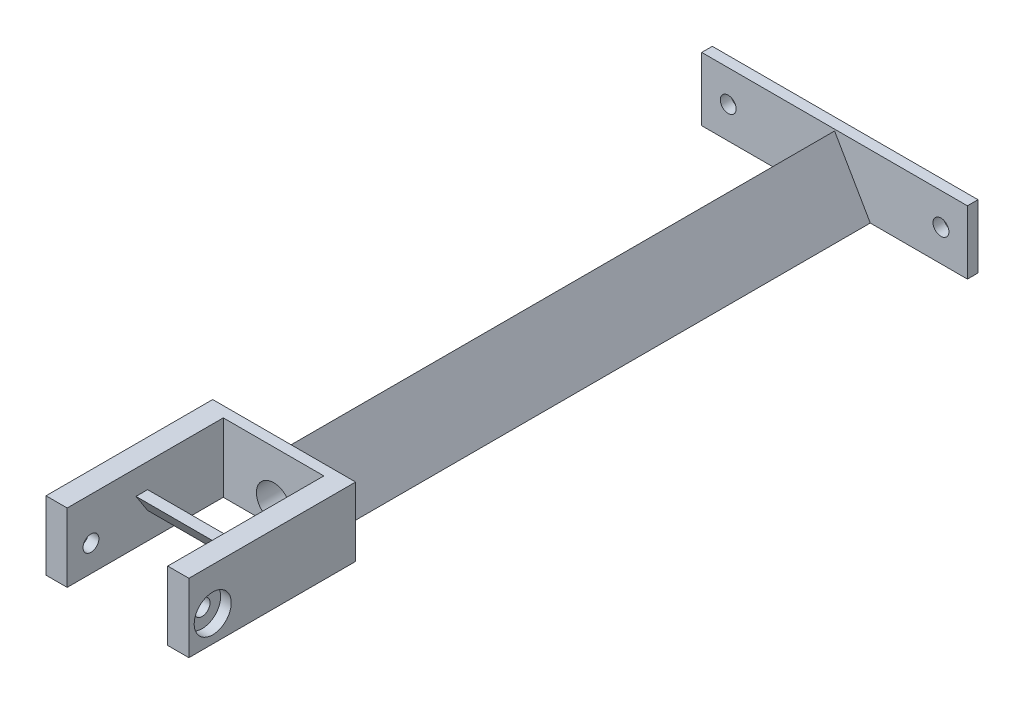
ISO-10303-21;
HEADER;
FILE_DESCRIPTION(('STEP AP214'),'2;1');
FILE_NAME('part.step','',(''),(''),'','','');
FILE_SCHEMA(('AUTOMOTIVE_DESIGN { 1 0 10303 214 1 1 1 1 }'));
ENDSEC;
DATA;
#1=APPLICATION_CONTEXT('core data for automotive mechanical design processes');
#2=APPLICATION_PROTOCOL_DEFINITION('international standard','automotive_design',2000,#1);
#3=PRODUCT_CONTEXT('',#1,'mechanical');
#4=PRODUCT('Part','Part','',(#3));
#5=PRODUCT_RELATED_PRODUCT_CATEGORY('part','',(#4));
#6=PRODUCT_DEFINITION_FORMATION('','',#4);
#7=PRODUCT_DEFINITION_CONTEXT('part definition',#1,'design');
#8=PRODUCT_DEFINITION('design','',#6,#7);
#9=PRODUCT_DEFINITION_SHAPE('','',#8);
#10=(LENGTH_UNIT() NAMED_UNIT(*) SI_UNIT(.MILLI.,.METRE.));
#11=(NAMED_UNIT(*) PLANE_ANGLE_UNIT() SI_UNIT($,.RADIAN.));
#12=(NAMED_UNIT(*) SI_UNIT($,.STERADIAN.) SOLID_ANGLE_UNIT());
#13=UNCERTAINTY_MEASURE_WITH_UNIT(LENGTH_MEASURE(1.E-05),#10,'distance_accuracy_value','');
#14=(GEOMETRIC_REPRESENTATION_CONTEXT(3) GLOBAL_UNCERTAINTY_ASSIGNED_CONTEXT((#13)) GLOBAL_UNIT_ASSIGNED_CONTEXT((#10,
#11,#12)) REPRESENTATION_CONTEXT('',''));
#15=CARTESIAN_POINT('',(0.,0.,0.));
#16=DIRECTION('',(0.,0.,1.));
#17=DIRECTION('',(1.,0.,0.));
#18=AXIS2_PLACEMENT_3D('',#15,#16,#17);
#19=CARTESIAN_POINT('',(-9.5,-9.,89.5));
#20=DIRECTION('',(-1.,0.,0.));
#21=DIRECTION('',(0.,0.,1.));
#22=AXIS2_PLACEMENT_3D('',#19,#20,#21);
#23=PLANE('',#22);
#24=CARTESIAN_POINT('',(-9.49999999999999,-1.,85.));
#25=DIRECTION('',(-1.,0.,0.));
#26=DIRECTION('',(0.,0.,1.));
#27=AXIS2_PLACEMENT_3D('',#24,#25,#26);
#28=CIRCLE('',#27,1.5);
#29=CARTESIAN_POINT('',(-9.49999999999999,-1.,86.5));
#30=VERTEX_POINT('',#29);
#31=EDGE_CURVE('E239',#30,#30,#28,.F.);
#32=ORIENTED_EDGE('',*,*,#31,.F.);
#33=EDGE_LOOP('',(#32));
#34=FACE_BOUND('',#33,.T.);
#35=DIRECTION('',(0.,1.,0.));
#36=VECTOR('',#35,1.);
#37=CARTESIAN_POINT('',(-9.5,-9.,74.3));
#38=LINE('',#37,#36);
#39=CARTESIAN_POINT('',(-9.5,-1.,74.3));
#40=VERTEX_POINT('',#39);
#41=CARTESIAN_POINT('',(-9.5,2.4,74.3));
#42=VERTEX_POINT('',#41);
#43=EDGE_CURVE('E218',#40,#42,#38,.T.);
#44=ORIENTED_EDGE('',*,*,#43,.F.);
#45=DIRECTION('',(0.,-0.839570157152152,-0.543251278157273));
#46=VECTOR('',#45,1.);
#47=CARTESIAN_POINT('',(-9.5,0.293658536585344,75.1370731707317));
#48=LINE('',#47,#46);
#49=CARTESIAN_POINT('',(-9.5,2.4,76.5));
#50=VERTEX_POINT('',#49);
#51=EDGE_CURVE('E219',#50,#40,#48,.T.);
#52=ORIENTED_EDGE('',*,*,#51,.F.);
#53=DIRECTION('',(0.,0.,1.));
#54=VECTOR('',#53,1.);
#55=CARTESIAN_POINT('',(-9.5,2.4,89.5));
#56=LINE('',#55,#54);
#57=EDGE_CURVE('E214',#42,#50,#56,.T.);
#58=ORIENTED_EDGE('',*,*,#57,.F.);
#59=EDGE_LOOP('',(#44,#52,#58));
#60=FACE_BOUND('',#59,.T.);
#61=DIRECTION('',(0.,0.,1.));
#62=VECTOR('',#61,1.);
#63=CARTESIAN_POINT('',(-9.5,-6.,89.5));
#64=LINE('',#63,#62);
#65=CARTESIAN_POINT('',(-9.5,-6.,60.));
#66=VERTEX_POINT('',#65);
#67=CARTESIAN_POINT('',(-9.5,-6.,89.5));
#68=VERTEX_POINT('',#67);
#69=EDGE_CURVE('E317',#66,#68,#64,.T.);
#70=ORIENTED_EDGE('',*,*,#69,.F.);
#71=DIRECTION('',(0.,-1.,0.));
#72=VECTOR('',#71,1.);
#73=CARTESIAN_POINT('',(-9.5,-9.,60.));
#74=LINE('',#73,#72);
#75=CARTESIAN_POINT('',(-9.5,7.,60.));
#76=VERTEX_POINT('',#75);
#77=EDGE_CURVE('E197',#76,#66,#74,.T.);
#78=ORIENTED_EDGE('',*,*,#77,.F.);
#79=DIRECTION('',(0.,0.,-1.));
#80=VECTOR('',#79,1.);
#81=CARTESIAN_POINT('',(-9.5,7.,89.5));
#82=LINE('',#81,#80);
#83=CARTESIAN_POINT('',(-9.5,7.,89.5));
#84=VERTEX_POINT('',#83);
#85=EDGE_CURVE('E267',#84,#76,#82,.T.);
#86=ORIENTED_EDGE('',*,*,#85,.F.);
#87=DIRECTION('',(0.,1.,0.));
#88=VECTOR('',#87,1.);
#89=CARTESIAN_POINT('',(-9.5,-9.,89.5));
#90=LINE('',#89,#88);
#91=EDGE_CURVE('E258',#68,#84,#90,.T.);
#92=ORIENTED_EDGE('',*,*,#91,.F.);
#93=EDGE_LOOP('',(#70,#78,#86,#92));
#94=FACE_BOUND('',#93,.T.);
#95=ADVANCED_FACE('F52',(#34,#60,#94),#23,.F.);
#96=CARTESIAN_POINT('',(9.5,-9.,89.5));
#97=DIRECTION('',(-1.,0.,0.));
#98=DIRECTION('',(0.,-1.,0.));
#99=AXIS2_PLACEMENT_3D('',#96,#97,#98);
#100=PLANE('',#99);
#101=DIRECTION('',(0.,0.839570157152152,0.543251278157273));
#102=VECTOR('',#101,1.);
#103=CARTESIAN_POINT('',(9.5,2.4,76.5));
#104=LINE('',#103,#102);
#105=CARTESIAN_POINT('',(9.5,-0.999999999999997,74.3));
#106=VERTEX_POINT('',#105);
#107=CARTESIAN_POINT('',(9.5,2.4,76.5));
#108=VERTEX_POINT('',#107);
#109=EDGE_CURVE('E205',#106,#108,#104,.T.);
#110=ORIENTED_EDGE('',*,*,#109,.F.);
#111=DIRECTION('',(0.,-1.,0.));
#112=VECTOR('',#111,1.);
#113=CARTESIAN_POINT('',(9.5,-0.999999999999997,74.3));
#114=LINE('',#113,#112);
#115=CARTESIAN_POINT('',(9.5,2.4,74.3));
#116=VERTEX_POINT('',#115);
#117=EDGE_CURVE('E196',#116,#106,#114,.T.);
#118=ORIENTED_EDGE('',*,*,#117,.F.);
#119=DIRECTION('',(0.,0.,-1.));
#120=VECTOR('',#119,1.);
#121=CARTESIAN_POINT('',(9.5,2.4,74.3));
#122=LINE('',#121,#120);
#123=EDGE_CURVE('E204',#108,#116,#122,.T.);
#124=ORIENTED_EDGE('',*,*,#123,.F.);
#125=EDGE_LOOP('',(#110,#118,#124));
#126=FACE_BOUND('',#125,.T.);
#127=CARTESIAN_POINT('',(9.5,-1.,85.));
#128=DIRECTION('',(-1.,0.,0.));
#129=DIRECTION('',(0.,-1.,0.));
#130=AXIS2_PLACEMENT_3D('',#127,#128,#129);
#131=CIRCLE('',#130,1.5);
#132=CARTESIAN_POINT('',(9.5,-2.5,85.));
#133=VERTEX_POINT('',#132);
#134=EDGE_CURVE('E240',#133,#133,#131,.F.);
#135=ORIENTED_EDGE('',*,*,#134,.T.);
#136=EDGE_LOOP('',(#135));
#137=FACE_BOUND('',#136,.T.);
#138=DIRECTION('',(0.,-1.,0.));
#139=VECTOR('',#138,1.);
#140=CARTESIAN_POINT('',(9.5,-9.,60.));
#141=LINE('',#140,#139);
#142=CARTESIAN_POINT('',(9.5,7.,60.));
#143=VERTEX_POINT('',#142);
#144=CARTESIAN_POINT('',(9.5,-5.99999999999999,60.));
#145=VERTEX_POINT('',#144);
#146=EDGE_CURVE('E193',#143,#145,#141,.T.);
#147=ORIENTED_EDGE('',*,*,#146,.T.);
#148=DIRECTION('',(0.,0.,1.));
#149=VECTOR('',#148,1.);
#150=CARTESIAN_POINT('',(9.5,-5.99999999999999,89.5));
#151=LINE('',#150,#149);
#152=CARTESIAN_POINT('',(9.5,-5.99999999999999,89.5));
#153=VERTEX_POINT('',#152);
#154=EDGE_CURVE('E311',#145,#153,#151,.T.);
#155=ORIENTED_EDGE('',*,*,#154,.T.);
#156=DIRECTION('',(0.,1.,0.));
#157=VECTOR('',#156,1.);
#158=CARTESIAN_POINT('',(9.5,-9.,89.5));
#159=LINE('',#158,#157);
#160=CARTESIAN_POINT('',(9.5,7.,89.5));
#161=VERTEX_POINT('',#160);
#162=EDGE_CURVE('E251',#153,#161,#159,.T.);
#163=ORIENTED_EDGE('',*,*,#162,.T.);
#164=DIRECTION('',(0.,0.,-1.));
#165=VECTOR('',#164,1.);
#166=CARTESIAN_POINT('',(9.5,7.,89.5));
#167=LINE('',#166,#165);
#168=EDGE_CURVE('E242',#161,#143,#167,.T.);
#169=ORIENTED_EDGE('',*,*,#168,.T.);
#170=EDGE_LOOP('',(#147,#155,#163,#169));
#171=FACE_BOUND('',#170,.T.);
#172=ADVANCED_FACE('F307',(#126,#137,#171),#100,.T.);
#173=CARTESIAN_POINT('',(-13.5,7.,89.5));
#174=DIRECTION('',(1.,0.,0.));
#175=DIRECTION('',(0.,1.,0.));
#176=AXIS2_PLACEMENT_3D('',#173,#174,#175);
#177=PLANE('',#176);
#178=CARTESIAN_POINT('',(-13.5,-1.,85.));
#179=DIRECTION('',(-1.,0.,0.));
#180=DIRECTION('',(0.,-1.,0.));
#181=AXIS2_PLACEMENT_3D('',#178,#179,#180);
#182=CIRCLE('',#181,3.50000000000001);
#183=CARTESIAN_POINT('',(-13.5,-4.50000000000001,85.));
#184=VERTEX_POINT('',#183);
#185=EDGE_CURVE('E234',#184,#184,#182,.T.);
#186=ORIENTED_EDGE('',*,*,#185,.F.);
#187=EDGE_LOOP('',(#186));
#188=FACE_BOUND('',#187,.T.);
#189=DIRECTION('',(0.,0.,-1.));
#190=VECTOR('',#189,1.);
#191=CARTESIAN_POINT('',(-13.5,-6.,89.5));
#192=LINE('',#191,#190);
#193=CARTESIAN_POINT('',(-13.5,-6.,89.5));
#194=VERTEX_POINT('',#193);
#195=CARTESIAN_POINT('',(-13.5,-6.,58.));
#196=VERTEX_POINT('',#195);
#197=EDGE_CURVE('E68',#194,#196,#192,.T.);
#198=ORIENTED_EDGE('',*,*,#197,.F.);
#199=DIRECTION('',(0.,-1.,0.));
#200=VECTOR('',#199,1.);
#201=CARTESIAN_POINT('',(-13.5,7.,89.5));
#202=LINE('',#201,#200);
#203=CARTESIAN_POINT('',(-13.5,7.,89.5));
#204=VERTEX_POINT('',#203);
#205=EDGE_CURVE('E257',#204,#194,#202,.T.);
#206=ORIENTED_EDGE('',*,*,#205,.F.);
#207=DIRECTION('',(0.,0.,-1.));
#208=VECTOR('',#207,1.);
#209=CARTESIAN_POINT('',(-13.5,7.,89.5));
#210=LINE('',#209,#208);
#211=CARTESIAN_POINT('',(-13.5,7.,58.));
#212=VERTEX_POINT('',#211);
#213=EDGE_CURVE('E265',#204,#212,#210,.T.);
#214=ORIENTED_EDGE('',*,*,#213,.T.);
#215=DIRECTION('',(0.,1.,0.));
#216=VECTOR('',#215,1.);
#217=CARTESIAN_POINT('',(-13.5,7.,58.));
#218=LINE('',#217,#216);
#219=EDGE_CURVE('E190',#196,#212,#218,.T.);
#220=ORIENTED_EDGE('',*,*,#219,.F.);
#221=EDGE_LOOP('',(#198,#206,#214,#220));
#222=FACE_BOUND('',#221,.T.);
#223=ADVANCED_FACE('F295',(#188,#222),#177,.F.);
#224=CARTESIAN_POINT('',(13.5,7.,89.5));
#225=DIRECTION('',(1.,0.,0.));
#226=DIRECTION('',(0.,1.,0.));
#227=AXIS2_PLACEMENT_3D('',#224,#225,#226);
#228=PLANE('',#227);
#229=CARTESIAN_POINT('',(13.5,-1.,85.));
#230=DIRECTION('',(-1.,0.,0.));
#231=DIRECTION('',(0.,-1.,0.));
#232=AXIS2_PLACEMENT_3D('',#229,#230,#231);
#233=CIRCLE('',#232,3.50000000000001);
#234=CARTESIAN_POINT('',(13.5,-4.50000000000001,85.));
#235=VERTEX_POINT('',#234);
#236=EDGE_CURVE('E221',#235,#235,#233,.T.);
#237=ORIENTED_EDGE('',*,*,#236,.T.);
#238=EDGE_LOOP('',(#237));
#239=FACE_BOUND('',#238,.T.);
#240=DIRECTION('',(0.,-1.,0.));
#241=VECTOR('',#240,1.);
#242=CARTESIAN_POINT('',(13.5,7.,89.5));
#243=LINE('',#242,#241);
#244=CARTESIAN_POINT('',(13.5,7.,89.5));
#245=VERTEX_POINT('',#244);
#246=CARTESIAN_POINT('',(13.5,-5.99999999999999,89.5));
#247=VERTEX_POINT('',#246);
#248=EDGE_CURVE('E250',#245,#247,#243,.T.);
#249=ORIENTED_EDGE('',*,*,#248,.T.);
#250=DIRECTION('',(0.,0.,-1.));
#251=VECTOR('',#250,1.);
#252=CARTESIAN_POINT('',(13.5,-5.99999999999999,89.5));
#253=LINE('',#252,#251);
#254=CARTESIAN_POINT('',(13.5,-5.99999999999999,58.));
#255=VERTEX_POINT('',#254);
#256=EDGE_CURVE('E164',#247,#255,#253,.T.);
#257=ORIENTED_EDGE('',*,*,#256,.T.);
#258=DIRECTION('',(0.,-1.,0.));
#259=VECTOR('',#258,1.);
#260=CARTESIAN_POINT('',(13.5,7.,58.));
#261=LINE('',#260,#259);
#262=CARTESIAN_POINT('',(13.5,7.,58.));
#263=VERTEX_POINT('',#262);
#264=EDGE_CURVE('E162',#263,#255,#261,.T.);
#265=ORIENTED_EDGE('',*,*,#264,.F.);
#266=DIRECTION('',(0.,0.,-1.));
#267=VECTOR('',#266,1.);
#268=CARTESIAN_POINT('',(13.5,7.,89.5));
#269=LINE('',#268,#267);
#270=EDGE_CURVE('E243',#245,#263,#269,.T.);
#271=ORIENTED_EDGE('',*,*,#270,.F.);
#272=EDGE_LOOP('',(#249,#257,#265,#271));
#273=FACE_BOUND('',#272,.T.);
#274=ADVANCED_FACE('F289',(#239,#273),#228,.T.);
#275=CARTESIAN_POINT('',(0.,14.,89.5));
#276=DIRECTION('',(0.,0.,1.));
#277=DIRECTION('',(1.,0.,0.));
#278=AXIS2_PLACEMENT_3D('',#275,#276,#277);
#279=PLANE('',#278);
#280=ORIENTED_EDGE('',*,*,#205,.T.);
#281=DIRECTION('',(1.,0.,0.));
#282=VECTOR('',#281,1.);
#283=CARTESIAN_POINT('',(0.,-6.,89.5));
#284=LINE('',#283,#282);
#285=EDGE_CURVE('E336',#194,#68,#284,.T.);
#286=ORIENTED_EDGE('',*,*,#285,.T.);
#287=ORIENTED_EDGE('',*,*,#91,.T.);
#288=DIRECTION('',(-1.,0.,0.));
#289=VECTOR('',#288,1.);
#290=CARTESIAN_POINT('',(-9.5,7.,89.5));
#291=LINE('',#290,#289);
#292=EDGE_CURVE('E256',#84,#204,#291,.T.);
#293=ORIENTED_EDGE('',*,*,#292,.T.);
#294=EDGE_LOOP('',(#280,#286,#287,#293));
#295=FACE_BOUND('',#294,.T.);
#296=ADVANCED_FACE('F291',(#295),#279,.T.);
#297=CARTESIAN_POINT('',(0.,14.,89.5));
#298=DIRECTION('',(0.,0.,-1.));
#299=DIRECTION('',(-1.,0.,0.));
#300=AXIS2_PLACEMENT_3D('',#297,#298,#299);
#301=PLANE('',#300);
#302=DIRECTION('',(-1.,0.,0.));
#303=VECTOR('',#302,1.);
#304=CARTESIAN_POINT('',(0.,-6.,89.5));
#305=LINE('',#304,#303);
#306=EDGE_CURVE('E305',#247,#153,#305,.T.);
#307=ORIENTED_EDGE('',*,*,#306,.F.);
#308=ORIENTED_EDGE('',*,*,#248,.F.);
#309=DIRECTION('',(1.,0.,0.));
#310=VECTOR('',#309,1.);
#311=CARTESIAN_POINT('',(9.5,7.,89.5));
#312=LINE('',#311,#310);
#313=EDGE_CURVE('E252',#161,#245,#312,.T.);
#314=ORIENTED_EDGE('',*,*,#313,.F.);
#315=ORIENTED_EDGE('',*,*,#162,.F.);
#316=EDGE_LOOP('',(#307,#308,#314,#315));
#317=FACE_BOUND('',#316,.T.);
#318=ADVANCED_FACE('F297',(#317),#301,.F.);
#319=CARTESIAN_POINT('',(0.,14.,60.));
#320=DIRECTION('',(0.,0.,-1.));
#321=DIRECTION('',(-1.,0.,0.));
#322=AXIS2_PLACEMENT_3D('',#319,#320,#321);
#323=PLANE('',#322);
#324=CARTESIAN_POINT('',(0.,-2.1,60.));
#325=DIRECTION('',(0.,0.,-1.));
#326=DIRECTION('',(-1.,0.,0.));
#327=AXIS2_PLACEMENT_3D('',#324,#325,#326);
#328=CIRCLE('',#327,3.25);
#329=CARTESIAN_POINT('',(-3.25,-2.1,60.));
#330=VERTEX_POINT('',#329);
#331=EDGE_CURVE('E322',#330,#330,#328,.F.);
#332=ORIENTED_EDGE('',*,*,#331,.F.);
#333=EDGE_LOOP('',(#332));
#334=FACE_BOUND('',#333,.T.);
#335=DIRECTION('',(-1.,0.,0.));
#336=VECTOR('',#335,1.);
#337=CARTESIAN_POINT('',(0.,-6.,60.));
#338=LINE('',#337,#336);
#339=EDGE_CURVE('E312',#145,#66,#338,.T.);
#340=ORIENTED_EDGE('',*,*,#339,.F.);
#341=ORIENTED_EDGE('',*,*,#146,.F.);
#342=DIRECTION('',(1.,0.,0.));
#343=VECTOR('',#342,1.);
#344=CARTESIAN_POINT('',(13.5,7.,60.));
#345=LINE('',#344,#343);
#346=EDGE_CURVE('E184',#76,#143,#345,.T.);
#347=ORIENTED_EDGE('',*,*,#346,.F.);
#348=ORIENTED_EDGE('',*,*,#77,.T.);
#349=EDGE_LOOP('',(#340,#341,#347,#348));
#350=FACE_BOUND('',#349,.T.);
#351=ADVANCED_FACE('F337',(#334,#350),#323,.F.);
#352=CARTESIAN_POINT('',(0.,14.,58.));
#353=DIRECTION('',(0.,0.,-1.));
#354=DIRECTION('',(-1.,0.,0.));
#355=AXIS2_PLACEMENT_3D('',#352,#353,#354);
#356=PLANE('',#355);
#357=ORIENTED_EDGE('',*,*,#264,.T.);
#358=DIRECTION('',(-1.,0.,0.));
#359=VECTOR('',#358,1.);
#360=CARTESIAN_POINT('',(0.,-6.,58.));
#361=LINE('',#360,#359);
#362=CARTESIAN_POINT('',(6.74999999999999,-5.99999999999999,58.));
#363=VERTEX_POINT('',#362);
#364=EDGE_CURVE('E151',#255,#363,#361,.T.);
#365=ORIENTED_EDGE('',*,*,#364,.T.);
#366=DIRECTION('',(0.5,-0.866025403784439,0.));
#367=VECTOR('',#366,1.);
#368=CARTESIAN_POINT('',(0.,5.69134295108992,58.));
#369=LINE('',#368,#367);
#370=CARTESIAN_POINT('',(0.,5.69134295108992,58.));
#371=VERTEX_POINT('',#370);
#372=EDGE_CURVE('E156',#371,#363,#369,.T.);
#373=ORIENTED_EDGE('',*,*,#372,.F.);
#374=DIRECTION('',(0.5,0.866025403784439,0.));
#375=VECTOR('',#374,1.);
#376=CARTESIAN_POINT('',(-6.75,-6.,58.));
#377=LINE('',#376,#375);
#378=CARTESIAN_POINT('',(-6.75,-6.,58.));
#379=VERTEX_POINT('',#378);
#380=EDGE_CURVE('E165',#379,#371,#377,.T.);
#381=ORIENTED_EDGE('',*,*,#380,.F.);
#382=EDGE_CURVE('E170',#379,#196,#361,.T.);
#383=ORIENTED_EDGE('',*,*,#382,.T.);
#384=ORIENTED_EDGE('',*,*,#219,.T.);
#385=DIRECTION('',(1.,0.,0.));
#386=VECTOR('',#385,1.);
#387=CARTESIAN_POINT('',(13.5,7.,58.));
#388=LINE('',#387,#386);
#389=EDGE_CURVE('E186',#212,#263,#388,.T.);
#390=ORIENTED_EDGE('',*,*,#389,.T.);
#391=EDGE_LOOP('',(#357,#365,#373,#381,#383,#384,#390));
#392=FACE_BOUND('',#391,.T.);
#393=ADVANCED_FACE('F158',(#392),#356,.T.);
#394=CARTESIAN_POINT('',(-25.11,6.,-46.));
#395=DIRECTION('',(0.,0.,1.));
#396=DIRECTION('',(1.,0.,0.));
#397=AXIS2_PLACEMENT_3D('',#394,#395,#396);
#398=PLANE('',#397);
#399=CARTESIAN_POINT('',(0.,-2.1,-46.));
#400=DIRECTION('',(0.,0.,1.));
#401=DIRECTION('',(1.,0.,0.));
#402=AXIS2_PLACEMENT_3D('',#399,#400,#401);
#403=CIRCLE('',#402,3.25);
#404=CARTESIAN_POINT('',(3.25,-2.1,-46.));
#405=VERTEX_POINT('',#404);
#406=EDGE_CURVE('E60',#405,#405,#403,.F.);
#407=ORIENTED_EDGE('',*,*,#406,.F.);
#408=EDGE_LOOP('',(#407));
#409=FACE_BOUND('',#408,.T.);
#410=DIRECTION('',(0.5,-0.866025403784439,0.));
#411=VECTOR('',#410,1.);
#412=CARTESIAN_POINT('',(0.,5.69134295108992,-46.));
#413=LINE('',#412,#411);
#414=CARTESIAN_POINT('',(0.,5.69134295108992,-46.));
#415=VERTEX_POINT('',#414);
#416=CARTESIAN_POINT('',(6.75,-6.,-46.));
#417=VERTEX_POINT('',#416);
#418=EDGE_CURVE('E269',#415,#417,#413,.T.);
#419=ORIENTED_EDGE('',*,*,#418,.T.);
#420=DIRECTION('',(-1.,0.,0.));
#421=VECTOR('',#420,1.);
#422=CARTESIAN_POINT('',(6.75,-6.,-46.));
#423=LINE('',#422,#421);
#424=CARTESIAN_POINT('',(-6.75,-6.,-46.));
#425=VERTEX_POINT('',#424);
#426=EDGE_CURVE('E12',#417,#425,#423,.T.);
#427=ORIENTED_EDGE('',*,*,#426,.T.);
#428=DIRECTION('',(0.5,0.866025403784439,0.));
#429=VECTOR('',#428,1.);
#430=CARTESIAN_POINT('',(-6.75,-6.,-46.));
#431=LINE('',#430,#429);
#432=EDGE_CURVE('E65',#425,#415,#431,.T.);
#433=ORIENTED_EDGE('',*,*,#432,.T.);
#434=EDGE_LOOP('',(#419,#427,#433));
#435=FACE_BOUND('',#434,.T.);
#436=ADVANCED_FACE('F54',(#409,#435),#398,.F.);
#437=CARTESIAN_POINT('',(9.5,7.,89.5));
#438=DIRECTION('',(0.,1.,0.));
#439=DIRECTION('',(-1.,0.,0.));
#440=AXIS2_PLACEMENT_3D('',#437,#438,#439);
#441=PLANE('',#440);
#442=ORIENTED_EDGE('',*,*,#270,.T.);
#443=ORIENTED_EDGE('',*,*,#389,.F.);
#444=ORIENTED_EDGE('',*,*,#213,.F.);
#445=ORIENTED_EDGE('',*,*,#292,.F.);
#446=ORIENTED_EDGE('',*,*,#85,.T.);
#447=ORIENTED_EDGE('',*,*,#346,.T.);
#448=ORIENTED_EDGE('',*,*,#168,.F.);
#449=ORIENTED_EDGE('',*,*,#313,.T.);
#450=EDGE_LOOP('',(#442,#443,#444,#445,#446,#447,#448,#449));
#451=FACE_BOUND('',#450,.T.);
#452=ADVANCED_FACE('F304',(#451),#441,.T.);
#453=CARTESIAN_POINT('',(25.1,-1.,85.));
#454=DIRECTION('',(-1.,0.,0.));
#455=DIRECTION('',(0.,0.,1.));
#456=AXIS2_PLACEMENT_3D('',#453,#454,#455);
#457=CYLINDRICAL_SURFACE('',#456,1.5);
#458=ORIENTED_EDGE('',*,*,#134,.F.);
#459=EDGE_LOOP('',(#458));
#460=FACE_BOUND('',#459,.T.);
#461=CARTESIAN_POINT('',(11.5,-1.,85.));
#462=DIRECTION('',(1.,0.,0.));
#463=DIRECTION('',(0.,1.,0.));
#464=AXIS2_PLACEMENT_3D('',#461,#462,#463);
#465=CIRCLE('',#464,1.5);
#466=CARTESIAN_POINT('',(11.5,0.499999999999995,85.));
#467=VERTEX_POINT('',#466);
#468=EDGE_CURVE('E227',#467,#467,#465,.T.);
#469=ORIENTED_EDGE('',*,*,#468,.T.);
#470=EDGE_LOOP('',(#469));
#471=FACE_BOUND('',#470,.T.);
#472=ADVANCED_FACE('F274',(#460,#471),#457,.F.);
#473=ORIENTED_EDGE('',*,*,#31,.T.);
#474=EDGE_LOOP('',(#473));
#475=FACE_BOUND('',#474,.T.);
#476=CARTESIAN_POINT('',(-11.5,-1.,85.));
#477=DIRECTION('',(-1.,0.,0.));
#478=DIRECTION('',(0.,-1.,0.));
#479=AXIS2_PLACEMENT_3D('',#476,#477,#478);
#480=CIRCLE('',#479,1.5);
#481=CARTESIAN_POINT('',(-11.5,-2.5,85.));
#482=VERTEX_POINT('',#481);
#483=EDGE_CURVE('E231',#482,#482,#480,.T.);
#484=ORIENTED_EDGE('',*,*,#483,.T.);
#485=EDGE_LOOP('',(#484));
#486=FACE_BOUND('',#485,.T.);
#487=ADVANCED_FACE('F385',(#475,#486),#457,.F.);
#488=CARTESIAN_POINT('',(-11.5,-1.,85.));
#489=DIRECTION('',(-1.,0.,0.));
#490=DIRECTION('',(0.,-1.,0.));
#491=AXIS2_PLACEMENT_3D('',#488,#489,#490);
#492=CYLINDRICAL_SURFACE('',#491,3.50000000000001);
#493=CARTESIAN_POINT('',(-11.5,-1.,85.));
#494=DIRECTION('',(-1.,0.,0.));
#495=DIRECTION('',(0.,-1.,0.));
#496=AXIS2_PLACEMENT_3D('',#493,#494,#495);
#497=CIRCLE('',#496,3.50000000000001);
#498=CARTESIAN_POINT('',(-11.5,-4.50000000000001,85.));
#499=VERTEX_POINT('',#498);
#500=EDGE_CURVE('E229',#499,#499,#497,.T.);
#501=ORIENTED_EDGE('',*,*,#500,.F.);
#502=EDGE_LOOP('',(#501));
#503=FACE_BOUND('',#502,.T.);
#504=ORIENTED_EDGE('',*,*,#185,.T.);
#505=EDGE_LOOP('',(#504));
#506=FACE_BOUND('',#505,.T.);
#507=ADVANCED_FACE('F381',(#503,#506),#492,.F.);
#508=CARTESIAN_POINT('',(-11.5,-1.,85.));
#509=DIRECTION('',(-1.,0.,0.));
#510=DIRECTION('',(0.,-1.,0.));
#511=AXIS2_PLACEMENT_3D('',#508,#509,#510);
#512=PLANE('',#511);
#513=ORIENTED_EDGE('',*,*,#483,.F.);
#514=EDGE_LOOP('',(#513));
#515=FACE_BOUND('',#514,.T.);
#516=ORIENTED_EDGE('',*,*,#500,.T.);
#517=EDGE_LOOP('',(#516));
#518=FACE_BOUND('',#517,.T.);
#519=ADVANCED_FACE('F288',(#515,#518),#512,.T.);
#520=CARTESIAN_POINT('',(11.5,-1.,85.));
#521=DIRECTION('',(1.,0.,0.));
#522=DIRECTION('',(0.,1.,0.));
#523=AXIS2_PLACEMENT_3D('',#520,#521,#522);
#524=CYLINDRICAL_SURFACE('',#523,3.50000000000001);
#525=CARTESIAN_POINT('',(11.5,-1.,85.));
#526=DIRECTION('',(-1.,0.,0.));
#527=DIRECTION('',(0.,-1.,0.));
#528=AXIS2_PLACEMENT_3D('',#525,#526,#527);
#529=CIRCLE('',#528,3.50000000000001);
#530=CARTESIAN_POINT('',(11.5,-4.50000000000001,85.));
#531=VERTEX_POINT('',#530);
#532=EDGE_CURVE('E222',#531,#531,#529,.T.);
#533=ORIENTED_EDGE('',*,*,#532,.T.);
#534=EDGE_LOOP('',(#533));
#535=FACE_BOUND('',#534,.T.);
#536=ORIENTED_EDGE('',*,*,#236,.F.);
#537=EDGE_LOOP('',(#536));
#538=FACE_BOUND('',#537,.T.);
#539=ADVANCED_FACE('F277',(#535,#538),#524,.F.);
#540=CARTESIAN_POINT('',(11.5,-1.,85.));
#541=DIRECTION('',(1.,0.,0.));
#542=DIRECTION('',(0.,-1.,0.));
#543=AXIS2_PLACEMENT_3D('',#540,#541,#542);
#544=PLANE('',#543);
#545=ORIENTED_EDGE('',*,*,#468,.F.);
#546=EDGE_LOOP('',(#545));
#547=FACE_BOUND('',#546,.T.);
#548=ORIENTED_EDGE('',*,*,#532,.F.);
#549=EDGE_LOOP('',(#548));
#550=FACE_BOUND('',#549,.T.);
#551=ADVANCED_FACE('F278',(#547,#550),#544,.T.);
#552=CARTESIAN_POINT('',(-12.5,-1.,74.3));
#553=DIRECTION('',(0.,0.,1.));
#554=DIRECTION('',(1.,0.,0.));
#555=AXIS2_PLACEMENT_3D('',#552,#553,#554);
#556=PLANE('',#555);
#557=DIRECTION('',(1.,0.,0.));
#558=VECTOR('',#557,1.);
#559=CARTESIAN_POINT('',(-12.5,-1.,74.3));
#560=LINE('',#559,#558);
#561=EDGE_CURVE('E215',#40,#106,#560,.T.);
#562=ORIENTED_EDGE('',*,*,#561,.F.);
#563=ORIENTED_EDGE('',*,*,#43,.T.);
#564=DIRECTION('',(1.,0.,0.));
#565=VECTOR('',#564,1.);
#566=CARTESIAN_POINT('',(-12.5,2.4,74.3));
#567=LINE('',#566,#565);
#568=EDGE_CURVE('E210',#42,#116,#567,.T.);
#569=ORIENTED_EDGE('',*,*,#568,.T.);
#570=ORIENTED_EDGE('',*,*,#117,.T.);
#571=EDGE_LOOP('',(#562,#563,#569,#570));
#572=FACE_BOUND('',#571,.T.);
#573=ADVANCED_FACE('F279',(#572),#556,.F.);
#574=CARTESIAN_POINT('',(-12.5,2.4,76.5));
#575=DIRECTION('',(0.,0.543251278157273,-0.839570157152152));
#576=DIRECTION('',(0.,0.839570157152152,0.543251278157273));
#577=AXIS2_PLACEMENT_3D('',#574,#575,#576);
#578=PLANE('',#577);
#579=DIRECTION('',(1.,0.,0.));
#580=VECTOR('',#579,1.);
#581=CARTESIAN_POINT('',(-12.5,2.4,76.5));
#582=LINE('',#581,#580);
#583=EDGE_CURVE('E209',#50,#108,#582,.T.);
#584=ORIENTED_EDGE('',*,*,#583,.F.);
#585=ORIENTED_EDGE('',*,*,#51,.T.);
#586=ORIENTED_EDGE('',*,*,#561,.T.);
#587=ORIENTED_EDGE('',*,*,#109,.T.);
#588=EDGE_LOOP('',(#584,#585,#586,#587));
#589=FACE_BOUND('',#588,.T.);
#590=ADVANCED_FACE('F395',(#589),#578,.F.);
#591=CARTESIAN_POINT('',(-12.5,2.4,74.3));
#592=DIRECTION('',(0.,-1.,0.));
#593=DIRECTION('',(1.,0.,0.));
#594=AXIS2_PLACEMENT_3D('',#591,#592,#593);
#595=PLANE('',#594);
#596=ORIENTED_EDGE('',*,*,#568,.F.);
#597=ORIENTED_EDGE('',*,*,#57,.T.);
#598=ORIENTED_EDGE('',*,*,#583,.T.);
#599=ORIENTED_EDGE('',*,*,#123,.T.);
#600=EDGE_LOOP('',(#596,#597,#598,#599));
#601=FACE_BOUND('',#600,.T.);
#602=ADVANCED_FACE('F400',(#601),#595,.F.);
#603=CARTESIAN_POINT('',(6.75,-6.,-46.));
#604=DIRECTION('',(0.,1.,0.));
#605=DIRECTION('',(-1.,0.,0.));
#606=AXIS2_PLACEMENT_3D('',#603,#604,#605);
#607=PLANE('',#606);
#608=DIRECTION('',(0.,0.,1.));
#609=VECTOR('',#608,1.);
#610=CARTESIAN_POINT('',(6.75,-6.,-46.));
#611=LINE('',#610,#609);
#612=EDGE_CURVE('E173',#417,#363,#611,.T.);
#613=ORIENTED_EDGE('',*,*,#612,.T.);
#614=ORIENTED_EDGE('',*,*,#364,.F.);
#615=ORIENTED_EDGE('',*,*,#256,.F.);
#616=ORIENTED_EDGE('',*,*,#306,.T.);
#617=ORIENTED_EDGE('',*,*,#154,.F.);
#618=ORIENTED_EDGE('',*,*,#339,.T.);
#619=ORIENTED_EDGE('',*,*,#69,.T.);
#620=ORIENTED_EDGE('',*,*,#285,.F.);
#621=ORIENTED_EDGE('',*,*,#197,.T.);
#622=ORIENTED_EDGE('',*,*,#382,.F.);
#623=DIRECTION('',(0.,0.,1.));
#624=VECTOR('',#623,1.);
#625=CARTESIAN_POINT('',(-6.75,-6.,-46.));
#626=LINE('',#625,#624);
#627=EDGE_CURVE('E177',#425,#379,#626,.T.);
#628=ORIENTED_EDGE('',*,*,#627,.F.);
#629=ORIENTED_EDGE('',*,*,#426,.F.);
#630=EDGE_LOOP('',(#613,#614,#615,#616,#617,#618,#619,#620,#621,#622,#628,#629));
#631=FACE_BOUND('',#630,.T.);
#632=ADVANCED_FACE('F180',(#631),#607,.F.);
#633=CARTESIAN_POINT('',(-6.75,-6.,-46.));
#634=DIRECTION('',(0.866025403784438,-0.5,0.));
#635=DIRECTION('',(0.5,0.866025403784439,0.));
#636=AXIS2_PLACEMENT_3D('',#633,#634,#635);
#637=PLANE('',#636);
#638=ORIENTED_EDGE('',*,*,#380,.T.);
#639=DIRECTION('',(0.,0.,1.));
#640=VECTOR('',#639,1.);
#641=CARTESIAN_POINT('',(0.,5.69134295108992,-46.));
#642=LINE('',#641,#640);
#643=EDGE_CURVE('E174',#415,#371,#642,.T.);
#644=ORIENTED_EDGE('',*,*,#643,.F.);
#645=ORIENTED_EDGE('',*,*,#432,.F.);
#646=ORIENTED_EDGE('',*,*,#627,.T.);
#647=EDGE_LOOP('',(#638,#644,#645,#646));
#648=FACE_BOUND('',#647,.T.);
#649=ADVANCED_FACE('F321',(#648),#637,.F.);
#650=CARTESIAN_POINT('',(0.,5.69134295108992,-46.));
#651=DIRECTION('',(-0.866025403784439,-0.5,0.));
#652=DIRECTION('',(0.5,-0.866025403784439,0.));
#653=AXIS2_PLACEMENT_3D('',#650,#651,#652);
#654=PLANE('',#653);
#655=ORIENTED_EDGE('',*,*,#372,.T.);
#656=ORIENTED_EDGE('',*,*,#612,.F.);
#657=ORIENTED_EDGE('',*,*,#418,.F.);
#658=ORIENTED_EDGE('',*,*,#643,.T.);
#659=EDGE_LOOP('',(#655,#656,#657,#658));
#660=FACE_BOUND('',#659,.T.);
#661=ADVANCED_FACE('F171',(#660),#654,.F.);
#662=CARTESIAN_POINT('',(0.,-2.1,-58.));
#663=DIRECTION('',(0.,0.,1.));
#664=DIRECTION('',(1.,0.,0.));
#665=AXIS2_PLACEMENT_3D('',#662,#663,#664);
#666=CYLINDRICAL_SURFACE('',#665,3.25);
#667=ORIENTED_EDGE('',*,*,#406,.T.);
#668=EDGE_LOOP('',(#667));
#669=FACE_BOUND('',#668,.T.);
#670=ORIENTED_EDGE('',*,*,#331,.T.);
#671=EDGE_LOOP('',(#670));
#672=FACE_BOUND('',#671,.T.);
#673=ADVANCED_FACE('F350',(#669,#672),#666,.F.);
#674=CLOSED_SHELL('',(#95,#172,#223,#274,#296,#318,#351,#393,#436,#452,#472,#487,#507,#519,#539,
#551,#573,#590,#602,#632,#649,#661,#673));
#675=MANIFOLD_SOLID_BREP('B2',#674);
#676=CARTESIAN_POINT('',(-25.1,-23.,-48.));
#677=DIRECTION('',(1.,0.,0.));
#678=DIRECTION('',(0.,0.,-1.));
#679=AXIS2_PLACEMENT_3D('',#676,#677,#678);
#680=PLANE('',#679);
#681=DIRECTION('',(0.,0.,-1.));
#682=VECTOR('',#681,1.);
#683=CARTESIAN_POINT('',(-25.1,-6.,118.));
#684=LINE('',#683,#682);
#685=CARTESIAN_POINT('',(-25.1,-6.,-46.));
#686=VERTEX_POINT('',#685);
#687=CARTESIAN_POINT('',(-25.1,-5.99999999999999,-48.));
#688=VERTEX_POINT('',#687);
#689=EDGE_CURVE('E590',#686,#688,#684,.T.);
#690=ORIENTED_EDGE('',*,*,#689,.F.);
#691=DIRECTION('',(0.,1.,0.));
#692=VECTOR('',#691,1.);
#693=CARTESIAN_POINT('',(-25.1,-23.,-46.));
#694=LINE('',#693,#692);
#695=CARTESIAN_POINT('',(-25.1,6.,-46.));
#696=VERTEX_POINT('',#695);
#697=EDGE_CURVE('E597',#686,#696,#694,.T.);
#698=ORIENTED_EDGE('',*,*,#697,.T.);
#699=DIRECTION('',(0.,0.,1.));
#700=VECTOR('',#699,1.);
#701=CARTESIAN_POINT('',(-25.1,6.,-48.));
#702=LINE('',#701,#700);
#703=CARTESIAN_POINT('',(-25.1,6.,-48.));
#704=VERTEX_POINT('',#703);
#705=EDGE_CURVE('E617',#704,#696,#702,.T.);
#706=ORIENTED_EDGE('',*,*,#705,.F.);
#707=DIRECTION('',(0.,1.,0.));
#708=VECTOR('',#707,1.);
#709=CARTESIAN_POINT('',(-25.1,-23.,-48.));
#710=LINE('',#709,#708);
#711=EDGE_CURVE('E606',#688,#704,#710,.T.);
#712=ORIENTED_EDGE('',*,*,#711,.F.);
#713=EDGE_LOOP('',(#690,#698,#706,#712));
#714=FACE_BOUND('',#713,.T.);
#715=ADVANCED_FACE('F572',(#714),#680,.F.);
#716=CARTESIAN_POINT('',(-25.11,-8.,-46.));
#717=DIRECTION('',(0.,0.,1.));
#718=DIRECTION('',(1.,0.,0.));
#719=AXIS2_PLACEMENT_3D('',#716,#717,#718);
#720=PLANE('',#719);
#721=CARTESIAN_POINT('',(0.,-2.1,-46.));
#722=DIRECTION('',(0.,0.,1.));
#723=DIRECTION('',(1.,0.,0.));
#724=AXIS2_PLACEMENT_3D('',#721,#722,#723);
#725=CIRCLE('',#724,3.25);
#726=CARTESIAN_POINT('',(3.25,-2.1,-46.));
#727=VERTEX_POINT('',#726);
#728=EDGE_CURVE('E664',#727,#727,#725,.F.);
#729=ORIENTED_EDGE('',*,*,#728,.T.);
#730=EDGE_LOOP('',(#729));
#731=FACE_BOUND('',#730,.T.);
#732=CARTESIAN_POINT('',(20.1,0.,-46.));
#733=DIRECTION('',(0.,0.,1.));
#734=DIRECTION('',(1.,0.,0.));
#735=AXIS2_PLACEMENT_3D('',#732,#733,#734);
#736=CIRCLE('',#735,1.5);
#737=CARTESIAN_POINT('',(21.6,0.,-46.));
#738=VERTEX_POINT('',#737);
#739=EDGE_CURVE('E585',#738,#738,#736,.T.);
#740=ORIENTED_EDGE('',*,*,#739,.F.);
#741=EDGE_LOOP('',(#740));
#742=FACE_BOUND('',#741,.T.);
#743=CARTESIAN_POINT('',(-20.1,0.,-46.));
#744=DIRECTION('',(0.,0.,1.));
#745=DIRECTION('',(1.,0.,0.));
#746=AXIS2_PLACEMENT_3D('',#743,#744,#745);
#747=CIRCLE('',#746,1.5);
#748=CARTESIAN_POINT('',(-18.6,0.,-46.));
#749=VERTEX_POINT('',#748);
#750=EDGE_CURVE('E639',#749,#749,#747,.T.);
#751=ORIENTED_EDGE('',*,*,#750,.F.);
#752=EDGE_LOOP('',(#751));
#753=FACE_BOUND('',#752,.T.);
#754=ORIENTED_EDGE('',*,*,#697,.F.);
#755=DIRECTION('',(1.,0.,0.));
#756=VECTOR('',#755,1.);
#757=CARTESIAN_POINT('',(-25.11,-6.,-46.));
#758=LINE('',#757,#756);
#759=CARTESIAN_POINT('',(25.1,-5.99999999999999,-46.));
#760=VERTEX_POINT('',#759);
#761=EDGE_CURVE('E623',#686,#760,#758,.T.);
#762=ORIENTED_EDGE('',*,*,#761,.T.);
#763=DIRECTION('',(0.,-1.,0.));
#764=VECTOR('',#763,1.);
#765=CARTESIAN_POINT('',(25.1,-23.,-46.));
#766=LINE('',#765,#764);
#767=CARTESIAN_POINT('',(25.1,6.,-46.));
#768=VERTEX_POINT('',#767);
#769=EDGE_CURVE('E627',#768,#760,#766,.T.);
#770=ORIENTED_EDGE('',*,*,#769,.F.);
#771=DIRECTION('',(1.,0.,0.));
#772=VECTOR('',#771,1.);
#773=CARTESIAN_POINT('',(25.1,6.,-46.));
#774=LINE('',#773,#772);
#775=EDGE_CURVE('E633',#696,#768,#774,.T.);
#776=ORIENTED_EDGE('',*,*,#775,.F.);
#777=EDGE_LOOP('',(#754,#762,#770,#776));
#778=FACE_BOUND('',#777,.T.);
#779=ADVANCED_FACE('F574',(#731,#742,#753,#778),#720,.T.);
#780=CARTESIAN_POINT('',(0.,0.,-48.));
#781=DIRECTION('',(0.,0.,1.));
#782=DIRECTION('',(1.,0.,0.));
#783=AXIS2_PLACEMENT_3D('',#780,#781,#782);
#784=PLANE('',#783);
#785=CARTESIAN_POINT('',(0.,-2.1,-48.));
#786=DIRECTION('',(0.,0.,1.));
#787=DIRECTION('',(1.,0.,0.));
#788=AXIS2_PLACEMENT_3D('',#785,#786,#787);
#789=CIRCLE('',#788,3.25);
#790=CARTESIAN_POINT('',(3.25,-2.1,-48.));
#791=VERTEX_POINT('',#790);
#792=EDGE_CURVE('E580',#791,#791,#789,.F.);
#793=ORIENTED_EDGE('',*,*,#792,.F.);
#794=EDGE_LOOP('',(#793));
#795=FACE_BOUND('',#794,.T.);
#796=CARTESIAN_POINT('',(20.1,0.,-48.));
#797=DIRECTION('',(0.,0.,1.));
#798=DIRECTION('',(1.,0.,0.));
#799=AXIS2_PLACEMENT_3D('',#796,#797,#798);
#800=CIRCLE('',#799,1.5);
#801=CARTESIAN_POINT('',(21.6,0.,-48.));
#802=VERTEX_POINT('',#801);
#803=EDGE_CURVE('E640',#802,#802,#800,.T.);
#804=ORIENTED_EDGE('',*,*,#803,.T.);
#805=EDGE_LOOP('',(#804));
#806=FACE_BOUND('',#805,.T.);
#807=CARTESIAN_POINT('',(-20.1,0.,-48.));
#808=DIRECTION('',(0.,0.,1.));
#809=DIRECTION('',(1.,0.,0.));
#810=AXIS2_PLACEMENT_3D('',#807,#808,#809);
#811=CIRCLE('',#810,1.5);
#812=CARTESIAN_POINT('',(-18.6,0.,-48.));
#813=VERTEX_POINT('',#812);
#814=EDGE_CURVE('E632',#813,#813,#811,.T.);
#815=ORIENTED_EDGE('',*,*,#814,.T.);
#816=EDGE_LOOP('',(#815));
#817=FACE_BOUND('',#816,.T.);
#818=DIRECTION('',(1.,0.,0.));
#819=VECTOR('',#818,1.);
#820=CARTESIAN_POINT('',(0.,-6.,-48.));
#821=LINE('',#820,#819);
#822=CARTESIAN_POINT('',(25.1,-5.99999999999999,-48.));
#823=VERTEX_POINT('',#822);
#824=EDGE_CURVE('E51',#688,#823,#821,.T.);
#825=ORIENTED_EDGE('',*,*,#824,.F.);
#826=ORIENTED_EDGE('',*,*,#711,.T.);
#827=DIRECTION('',(1.,0.,0.));
#828=VECTOR('',#827,1.);
#829=CARTESIAN_POINT('',(25.1,6.,-48.));
#830=LINE('',#829,#828);
#831=CARTESIAN_POINT('',(25.1,6.,-48.));
#832=VERTEX_POINT('',#831);
#833=EDGE_CURVE('E611',#704,#832,#830,.T.);
#834=ORIENTED_EDGE('',*,*,#833,.T.);
#835=DIRECTION('',(0.,-1.,0.));
#836=VECTOR('',#835,1.);
#837=CARTESIAN_POINT('',(25.1,-23.,-48.));
#838=LINE('',#837,#836);
#839=EDGE_CURVE('E614',#832,#823,#838,.T.);
#840=ORIENTED_EDGE('',*,*,#839,.T.);
#841=EDGE_LOOP('',(#825,#826,#834,#840));
#842=FACE_BOUND('',#841,.T.);
#843=ADVANCED_FACE('F608',(#795,#806,#817,#842),#784,.F.);
#844=CARTESIAN_POINT('',(25.1,6.,-48.));
#845=DIRECTION('',(0.,-1.,0.));
#846=DIRECTION('',(0.,0.,-1.));
#847=AXIS2_PLACEMENT_3D('',#844,#845,#846);
#848=PLANE('',#847);
#849=ORIENTED_EDGE('',*,*,#775,.T.);
#850=DIRECTION('',(0.,0.,1.));
#851=VECTOR('',#850,1.);
#852=CARTESIAN_POINT('',(25.1,6.,-48.));
#853=LINE('',#852,#851);
#854=EDGE_CURVE('E619',#832,#768,#853,.T.);
#855=ORIENTED_EDGE('',*,*,#854,.F.);
#856=ORIENTED_EDGE('',*,*,#833,.F.);
#857=ORIENTED_EDGE('',*,*,#705,.T.);
#858=EDGE_LOOP('',(#849,#855,#856,#857));
#859=FACE_BOUND('',#858,.T.);
#860=ADVANCED_FACE('F621',(#859),#848,.F.);
#861=CARTESIAN_POINT('',(25.1,-23.,-48.));
#862=DIRECTION('',(-1.,0.,0.));
#863=DIRECTION('',(0.,0.,1.));
#864=AXIS2_PLACEMENT_3D('',#861,#862,#863);
#865=PLANE('',#864);
#866=ORIENTED_EDGE('',*,*,#769,.T.);
#867=DIRECTION('',(0.,0.,-1.));
#868=VECTOR('',#867,1.);
#869=CARTESIAN_POINT('',(25.1,-5.99999999999999,118.));
#870=LINE('',#869,#868);
#871=EDGE_CURVE('E656',#760,#823,#870,.T.);
#872=ORIENTED_EDGE('',*,*,#871,.T.);
#873=ORIENTED_EDGE('',*,*,#839,.F.);
#874=ORIENTED_EDGE('',*,*,#854,.T.);
#875=EDGE_LOOP('',(#866,#872,#873,#874));
#876=FACE_BOUND('',#875,.T.);
#877=ADVANCED_FACE('F679',(#876),#865,.F.);
#878=CARTESIAN_POINT('',(-20.1,0.,-54.));
#879=DIRECTION('',(0.,0.,1.));
#880=DIRECTION('',(1.,0.,0.));
#881=AXIS2_PLACEMENT_3D('',#878,#879,#880);
#882=CYLINDRICAL_SURFACE('',#881,1.5);
#883=ORIENTED_EDGE('',*,*,#750,.T.);
#884=EDGE_LOOP('',(#883));
#885=FACE_BOUND('',#884,.T.);
#886=ORIENTED_EDGE('',*,*,#814,.F.);
#887=EDGE_LOOP('',(#886));
#888=FACE_BOUND('',#887,.T.);
#889=ADVANCED_FACE('F648',(#885,#888),#882,.F.);
#890=CARTESIAN_POINT('',(20.1,0.,-54.));
#891=DIRECTION('',(0.,0.,1.));
#892=DIRECTION('',(1.,0.,0.));
#893=AXIS2_PLACEMENT_3D('',#890,#891,#892);
#894=CYLINDRICAL_SURFACE('',#893,1.5);
#895=ORIENTED_EDGE('',*,*,#739,.T.);
#896=EDGE_LOOP('',(#895));
#897=FACE_BOUND('',#896,.T.);
#898=ORIENTED_EDGE('',*,*,#803,.F.);
#899=EDGE_LOOP('',(#898));
#900=FACE_BOUND('',#899,.T.);
#901=ADVANCED_FACE('F677',(#897,#900),#894,.F.);
#902=CARTESIAN_POINT('',(25.1,-5.99999999999999,118.));
#903=DIRECTION('',(0.,-1.,0.));
#904=DIRECTION('',(1.,0.,0.));
#905=AXIS2_PLACEMENT_3D('',#902,#903,#904);
#906=PLANE('',#905);
#907=ORIENTED_EDGE('',*,*,#689,.T.);
#908=ORIENTED_EDGE('',*,*,#824,.T.);
#909=ORIENTED_EDGE('',*,*,#871,.F.);
#910=ORIENTED_EDGE('',*,*,#761,.F.);
#911=EDGE_LOOP('',(#907,#908,#909,#910));
#912=FACE_BOUND('',#911,.T.);
#913=ADVANCED_FACE('F684',(#912),#906,.T.);
#914=CARTESIAN_POINT('',(0.,-2.1,-58.));
#915=DIRECTION('',(0.,0.,1.));
#916=DIRECTION('',(1.,0.,0.));
#917=AXIS2_PLACEMENT_3D('',#914,#915,#916);
#918=CYLINDRICAL_SURFACE('',#917,3.25);
#919=ORIENTED_EDGE('',*,*,#728,.F.);
#920=EDGE_LOOP('',(#919));
#921=FACE_BOUND('',#920,.T.);
#922=ORIENTED_EDGE('',*,*,#792,.T.);
#923=EDGE_LOOP('',(#922));
#924=FACE_BOUND('',#923,.T.);
#925=ADVANCED_FACE('F667',(#921,#924),#918,.F.);
#926=CLOSED_SHELL('',(#715,#779,#843,#860,#877,#889,#901,#913,#925));
#927=MANIFOLD_SOLID_BREP('B6',#926);
#928=ADVANCED_BREP_SHAPE_REPRESENTATION('',(#18,#675,#927),#14);
#929=SHAPE_DEFINITION_REPRESENTATION(#9,#928);
ENDSEC;
END-ISO-10303-21;
